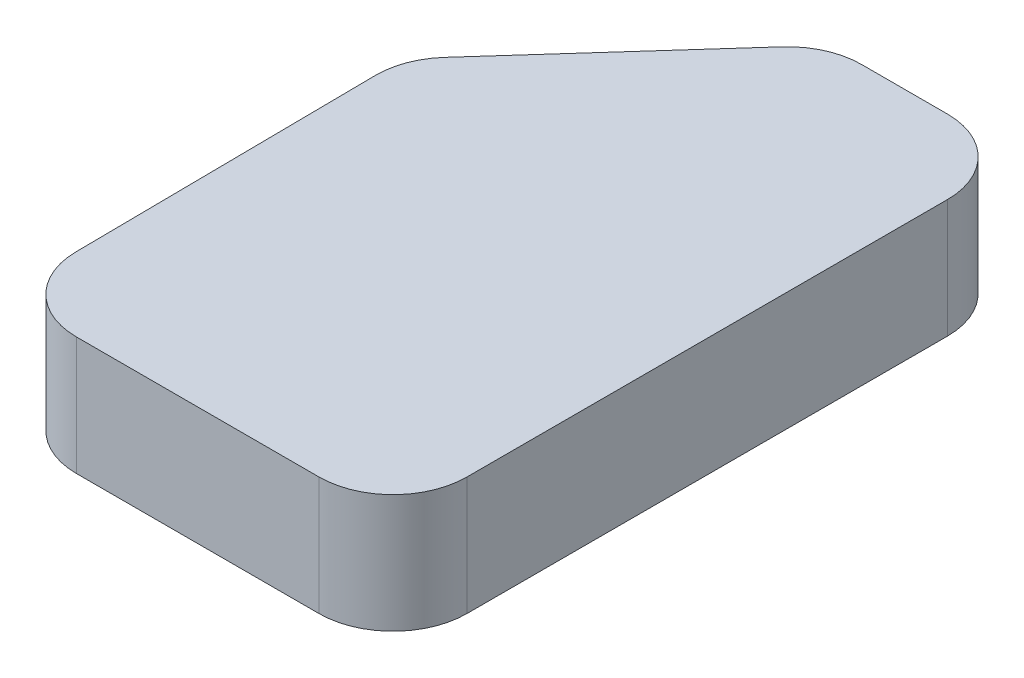
ISO-10303-21;
HEADER;
FILE_DESCRIPTION(('STEP AP214'),'2;1');
FILE_NAME('part.step','',(''),(''),'','','');
FILE_SCHEMA(('AUTOMOTIVE_DESIGN { 1 0 10303 214 1 1 1 1 }'));
ENDSEC;
DATA;
#1=APPLICATION_CONTEXT('core data for automotive mechanical design processes');
#2=APPLICATION_PROTOCOL_DEFINITION('international standard','automotive_design',2000,#1);
#3=PRODUCT_CONTEXT('',#1,'mechanical');
#4=PRODUCT('Part','Part','',(#3));
#5=PRODUCT_RELATED_PRODUCT_CATEGORY('part','',(#4));
#6=PRODUCT_DEFINITION_FORMATION('','',#4);
#7=PRODUCT_DEFINITION_CONTEXT('part definition',#1,'design');
#8=PRODUCT_DEFINITION('design','',#6,#7);
#9=PRODUCT_DEFINITION_SHAPE('','',#8);
#10=(LENGTH_UNIT() NAMED_UNIT(*) SI_UNIT(.MILLI.,.METRE.));
#11=(NAMED_UNIT(*) PLANE_ANGLE_UNIT() SI_UNIT($,.RADIAN.));
#12=(NAMED_UNIT(*) SI_UNIT($,.STERADIAN.) SOLID_ANGLE_UNIT());
#13=UNCERTAINTY_MEASURE_WITH_UNIT(LENGTH_MEASURE(1.E-05),#10,'distance_accuracy_value','');
#14=(GEOMETRIC_REPRESENTATION_CONTEXT(3) GLOBAL_UNCERTAINTY_ASSIGNED_CONTEXT((#13)) GLOBAL_UNIT_ASSIGNED_CONTEXT((#10,
#11,#12)) REPRESENTATION_CONTEXT('',''));
#15=CARTESIAN_POINT('',(0.,0.,0.));
#16=DIRECTION('',(0.,0.,1.));
#17=DIRECTION('',(1.,0.,0.));
#18=AXIS2_PLACEMENT_3D('',#15,#16,#17);
#19=CARTESIAN_POINT('',(0.,0.,85.));
#20=DIRECTION('',(0.,1.,0.));
#21=DIRECTION('',(0.,0.,1.));
#22=AXIS2_PLACEMENT_3D('',#19,#20,#21);
#23=PLANE('',#22);
#24=DIRECTION('',(1.,0.,0.));
#25=VECTOR('',#24,1.);
#26=CARTESIAN_POINT('',(0.,0.,0.));
#27=LINE('',#26,#25);
#28=CARTESIAN_POINT('',(58.3617304464966,0.,0.));
#29=VERTEX_POINT('',#28);
#30=CARTESIAN_POINT('',(70.,0.,0.));
#31=VERTEX_POINT('',#30);
#32=EDGE_CURVE('E133',#29,#31,#27,.T.);
#33=ORIENTED_EDGE('',*,*,#32,.T.);
#34=CARTESIAN_POINT('',(70.,0.,9.99999999999999));
#35=DIRECTION('',(0.,1.,0.));
#36=DIRECTION('',(0.,0.,1.));
#37=AXIS2_PLACEMENT_3D('',#34,#35,#36);
#38=CIRCLE('',#37,10.);
#39=CARTESIAN_POINT('',(80.,0.,9.99999999999999));
#40=VERTEX_POINT('',#39);
#41=EDGE_CURVE('E169',#31,#40,#38,.F.);
#42=ORIENTED_EDGE('',*,*,#41,.T.);
#43=DIRECTION('',(0.,0.,-1.));
#44=VECTOR('',#43,1.);
#45=CARTESIAN_POINT('',(80.,0.,85.));
#46=LINE('',#45,#44);
#47=CARTESIAN_POINT('',(80.,0.,75.));
#48=VERTEX_POINT('',#47);
#49=EDGE_CURVE('E147',#48,#40,#46,.T.);
#50=ORIENTED_EDGE('',*,*,#49,.F.);
#51=CARTESIAN_POINT('',(70.,0.,75.));
#52=DIRECTION('',(0.,1.,0.));
#53=DIRECTION('',(0.,0.,1.));
#54=AXIS2_PLACEMENT_3D('',#51,#52,#53);
#55=CIRCLE('',#54,10.);
#56=CARTESIAN_POINT('',(70.,0.,85.));
#57=VERTEX_POINT('',#56);
#58=EDGE_CURVE('E167',#48,#57,#55,.F.);
#59=ORIENTED_EDGE('',*,*,#58,.T.);
#60=DIRECTION('',(1.,0.,0.));
#61=VECTOR('',#60,1.);
#62=CARTESIAN_POINT('',(0.,0.,85.));
#63=LINE('',#62,#61);
#64=CARTESIAN_POINT('',(37.1976753077025,0.,85.));
#65=VERTEX_POINT('',#64);
#66=EDGE_CURVE('E135',#65,#57,#63,.T.);
#67=ORIENTED_EDGE('',*,*,#66,.F.);
#68=CARTESIAN_POINT('',(37.1976753077025,0.,75.));
#69=DIRECTION('',(0.,1.,0.));
#70=DIRECTION('',(0.,0.,1.));
#71=AXIS2_PLACEMENT_3D('',#68,#69,#70);
#72=CIRCLE('',#71,10.);
#73=CARTESIAN_POINT('',(27.1982021294255,0.,75.1026457837416));
#74=VERTEX_POINT('',#73);
#75=EDGE_CURVE('E53',#65,#74,#72,.F.);
#76=ORIENTED_EDGE('',*,*,#75,.T.);
#77=DIRECTION('',(0.0102645783741567,0.,0.999947317827695));
#78=VECTOR('',#77,1.);
#79=CARTESIAN_POINT('',(27.2997996498532,0.,85.));
#80=LINE('',#79,#78);
#81=CARTESIAN_POINT('',(26.7778913454717,0.,34.1571119538378));
#82=VERTEX_POINT('',#81);
#83=EDGE_CURVE('E185',#82,#74,#80,.T.);
#84=ORIENTED_EDGE('',*,*,#83,.F.);
#85=CARTESIAN_POINT('',(36.7773645237486,0.,34.0544661700962));
#86=DIRECTION('',(0.,1.,0.));
#87=DIRECTION('',(0.,0.,1.));
#88=AXIS2_PLACEMENT_3D('',#85,#86,#87);
#89=CIRCLE('',#88,10.);
#90=CARTESIAN_POINT('',(29.3344840482113,0.,27.3758787276152));
#91=VERTEX_POINT('',#90);
#92=EDGE_CURVE('E47',#82,#91,#89,.F.);
#93=ORIENTED_EDGE('',*,*,#92,.T.);
#94=DIRECTION('',(0.667858744248108,0.,-0.744288047553728));
#95=VECTOR('',#94,1.);
#96=CARTESIAN_POINT('',(29.8582506980114,0.,26.7921725764105));
#97=LINE('',#96,#95);
#98=CARTESIAN_POINT('',(50.9188499700445,0.,3.32141255792718));
#99=VERTEX_POINT('',#98);
#100=EDGE_CURVE('E105',#91,#99,#97,.T.);
#101=ORIENTED_EDGE('',*,*,#100,.T.);
#102=CARTESIAN_POINT('',(58.3617304464966,0.,10.0000000012292));
#103=DIRECTION('',(0.,1.,0.));
#104=DIRECTION('',(0.,0.,1.));
#105=AXIS2_PLACEMENT_3D('',#102,#103,#104);
#106=CIRCLE('',#105,10.0000000012292);
#107=EDGE_CURVE('E109',#99,#29,#106,.F.);
#108=ORIENTED_EDGE('',*,*,#107,.T.);
#109=EDGE_LOOP('',(#33,#42,#50,#59,#67,#76,#84,#93,#101,#108));
#110=FACE_BOUND('',#109,.T.);
#111=ADVANCED_FACE('F32',(#110),#23,.F.);
#112=CARTESIAN_POINT('',(0.,16.,85.));
#113=DIRECTION('',(0.,-1.,0.));
#114=DIRECTION('',(0.,0.,-1.));
#115=AXIS2_PLACEMENT_3D('',#112,#113,#114);
#116=PLANE('',#115);
#117=DIRECTION('',(0.,0.,-1.));
#118=VECTOR('',#117,1.);
#119=CARTESIAN_POINT('',(80.,16.,85.));
#120=LINE('',#119,#118);
#121=CARTESIAN_POINT('',(80.,16.,75.));
#122=VERTEX_POINT('',#121);
#123=CARTESIAN_POINT('',(80.,16.,9.99999999999999));
#124=VERTEX_POINT('',#123);
#125=EDGE_CURVE('E142',#122,#124,#120,.T.);
#126=ORIENTED_EDGE('',*,*,#125,.T.);
#127=CARTESIAN_POINT('',(70.,16.,9.99999999999999));
#128=DIRECTION('',(0.,-1.,0.));
#129=DIRECTION('',(0.,0.,-1.));
#130=AXIS2_PLACEMENT_3D('',#127,#128,#129);
#131=CIRCLE('',#130,10.);
#132=CARTESIAN_POINT('',(70.,16.,0.));
#133=VERTEX_POINT('',#132);
#134=EDGE_CURVE('E161',#124,#133,#131,.F.);
#135=ORIENTED_EDGE('',*,*,#134,.T.);
#136=DIRECTION('',(-1.,0.,0.));
#137=VECTOR('',#136,1.);
#138=CARTESIAN_POINT('',(0.,16.,0.));
#139=LINE('',#138,#137);
#140=CARTESIAN_POINT('',(58.3617304464966,16.,0.));
#141=VERTEX_POINT('',#140);
#142=EDGE_CURVE('E139',#133,#141,#139,.T.);
#143=ORIENTED_EDGE('',*,*,#142,.T.);
#144=CARTESIAN_POINT('',(58.3617304464966,16.,10.0000000012292));
#145=DIRECTION('',(0.,1.,0.));
#146=DIRECTION('',(0.,0.,1.));
#147=AXIS2_PLACEMENT_3D('',#144,#145,#146);
#148=CIRCLE('',#147,10.0000000012292);
#149=CARTESIAN_POINT('',(50.9188499700445,16.,3.32141255792718));
#150=VERTEX_POINT('',#149);
#151=EDGE_CURVE('E113',#150,#141,#148,.F.);
#152=ORIENTED_EDGE('',*,*,#151,.F.);
#153=DIRECTION('',(0.667858744248108,0.,-0.744288047553728));
#154=VECTOR('',#153,1.);
#155=CARTESIAN_POINT('',(29.8582506980114,16.,26.7921725764105));
#156=LINE('',#155,#154);
#157=CARTESIAN_POINT('',(29.3344840482113,16.,27.3758787276152));
#158=VERTEX_POINT('',#157);
#159=EDGE_CURVE('E119',#158,#150,#156,.T.);
#160=ORIENTED_EDGE('',*,*,#159,.F.);
#161=CARTESIAN_POINT('',(36.7773645237486,16.,34.0544661700962));
#162=DIRECTION('',(0.,-1.,0.));
#163=DIRECTION('',(0.,0.,-1.));
#164=AXIS2_PLACEMENT_3D('',#161,#162,#163);
#165=CIRCLE('',#164,10.);
#166=CARTESIAN_POINT('',(26.7778913454717,16.,34.1571119538378));
#167=VERTEX_POINT('',#166);
#168=EDGE_CURVE('E155',#158,#167,#165,.F.);
#169=ORIENTED_EDGE('',*,*,#168,.T.);
#170=DIRECTION('',(0.0102645783741567,0.,0.999947317827695));
#171=VECTOR('',#170,1.);
#172=CARTESIAN_POINT('',(27.2997996498532,16.,85.));
#173=LINE('',#172,#171);
#174=CARTESIAN_POINT('',(27.1982021294255,16.,75.1026457837416));
#175=VERTEX_POINT('',#174);
#176=EDGE_CURVE('E131',#167,#175,#173,.T.);
#177=ORIENTED_EDGE('',*,*,#176,.T.);
#178=CARTESIAN_POINT('',(37.1976753077025,16.,75.));
#179=DIRECTION('',(0.,-1.,0.));
#180=DIRECTION('',(0.,0.,-1.));
#181=AXIS2_PLACEMENT_3D('',#178,#179,#180);
#182=CIRCLE('',#181,10.);
#183=CARTESIAN_POINT('',(37.1976753077025,16.,85.));
#184=VERTEX_POINT('',#183);
#185=EDGE_CURVE('E157',#175,#184,#182,.F.);
#186=ORIENTED_EDGE('',*,*,#185,.T.);
#187=DIRECTION('',(-1.,0.,0.));
#188=VECTOR('',#187,1.);
#189=CARTESIAN_POINT('',(0.,16.,85.));
#190=LINE('',#189,#188);
#191=CARTESIAN_POINT('',(70.,16.,85.));
#192=VERTEX_POINT('',#191);
#193=EDGE_CURVE('E138',#192,#184,#190,.T.);
#194=ORIENTED_EDGE('',*,*,#193,.F.);
#195=CARTESIAN_POINT('',(70.,16.,75.));
#196=DIRECTION('',(0.,-1.,0.));
#197=DIRECTION('',(0.,0.,-1.));
#198=AXIS2_PLACEMENT_3D('',#195,#196,#197);
#199=CIRCLE('',#198,10.);
#200=EDGE_CURVE('E159',#192,#122,#199,.F.);
#201=ORIENTED_EDGE('',*,*,#200,.T.);
#202=EDGE_LOOP('',(#126,#135,#143,#152,#160,#169,#177,#186,#194,#201));
#203=FACE_BOUND('',#202,.T.);
#204=ADVANCED_FACE('F189',(#203),#116,.F.);
#205=CARTESIAN_POINT('',(80.,0.,85.));
#206=DIRECTION('',(-1.,0.,0.));
#207=DIRECTION('',(0.,0.,1.));
#208=AXIS2_PLACEMENT_3D('',#205,#206,#207);
#209=PLANE('',#208);
#210=ORIENTED_EDGE('',*,*,#49,.T.);
#211=DIRECTION('',(0.,1.,0.));
#212=VECTOR('',#211,1.);
#213=CARTESIAN_POINT('',(80.,16.,9.99999999999999));
#214=LINE('',#213,#212);
#215=EDGE_CURVE('E152',#40,#124,#214,.T.);
#216=ORIENTED_EDGE('',*,*,#215,.T.);
#217=ORIENTED_EDGE('',*,*,#125,.F.);
#218=DIRECTION('',(0.,1.,0.));
#219=VECTOR('',#218,1.);
#220=CARTESIAN_POINT('',(80.,0.,75.));
#221=LINE('',#220,#219);
#222=EDGE_CURVE('E150',#122,#48,#221,.F.);
#223=ORIENTED_EDGE('',*,*,#222,.T.);
#224=EDGE_LOOP('',(#210,#216,#217,#223));
#225=FACE_BOUND('',#224,.T.);
#226=ADVANCED_FACE('F205',(#225),#209,.F.);
#227=CARTESIAN_POINT('',(0.,0.,85.));
#228=DIRECTION('',(0.,0.,-1.));
#229=DIRECTION('',(-1.,0.,0.));
#230=AXIS2_PLACEMENT_3D('',#227,#228,#229);
#231=PLANE('',#230);
#232=ORIENTED_EDGE('',*,*,#66,.T.);
#233=DIRECTION('',(0.,1.,0.));
#234=VECTOR('',#233,1.);
#235=CARTESIAN_POINT('',(70.,0.,85.));
#236=LINE('',#235,#234);
#237=EDGE_CURVE('E174',#57,#192,#236,.T.);
#238=ORIENTED_EDGE('',*,*,#237,.T.);
#239=ORIENTED_EDGE('',*,*,#193,.T.);
#240=DIRECTION('',(0.,-1.,0.));
#241=VECTOR('',#240,1.);
#242=CARTESIAN_POINT('',(37.1976753077025,0.,85.));
#243=LINE('',#242,#241);
#244=EDGE_CURVE('E171',#184,#65,#243,.T.);
#245=ORIENTED_EDGE('',*,*,#244,.T.);
#246=EDGE_LOOP('',(#232,#238,#239,#245));
#247=FACE_BOUND('',#246,.T.);
#248=ADVANCED_FACE('F196',(#247),#231,.F.);
#249=CARTESIAN_POINT('',(0.,0.,0.));
#250=DIRECTION('',(0.,0.,-1.));
#251=DIRECTION('',(-1.,0.,0.));
#252=AXIS2_PLACEMENT_3D('',#249,#250,#251);
#253=PLANE('',#252);
#254=ORIENTED_EDGE('',*,*,#142,.F.);
#255=DIRECTION('',(0.,1.,0.));
#256=VECTOR('',#255,1.);
#257=CARTESIAN_POINT('',(70.,0.,0.));
#258=LINE('',#257,#256);
#259=EDGE_CURVE('E163',#133,#31,#258,.F.);
#260=ORIENTED_EDGE('',*,*,#259,.T.);
#261=ORIENTED_EDGE('',*,*,#32,.F.);
#262=DIRECTION('',(0.,1.,0.));
#263=VECTOR('',#262,1.);
#264=CARTESIAN_POINT('',(58.3617304464966,0.,0.));
#265=LINE('',#264,#263);
#266=EDGE_CURVE('E123',#29,#141,#265,.T.);
#267=ORIENTED_EDGE('',*,*,#266,.T.);
#268=EDGE_LOOP('',(#254,#260,#261,#267));
#269=FACE_BOUND('',#268,.T.);
#270=ADVANCED_FACE('F213',(#269),#253,.T.);
#271=CARTESIAN_POINT('',(29.8582506980114,0.,26.7921725764105));
#272=DIRECTION('',(0.744288047553728,0.,0.667858744248108));
#273=DIRECTION('',(0.667858744248108,0.,-0.744288047553728));
#274=AXIS2_PLACEMENT_3D('',#271,#272,#273);
#275=PLANE('',#274);
#276=ORIENTED_EDGE('',*,*,#100,.F.);
#277=DIRECTION('',(0.,-1.,0.));
#278=VECTOR('',#277,1.);
#279=CARTESIAN_POINT('',(29.3344840482113,0.,27.3758787276152));
#280=LINE('',#279,#278);
#281=EDGE_CURVE('E11',#91,#158,#280,.F.);
#282=ORIENTED_EDGE('',*,*,#281,.T.);
#283=ORIENTED_EDGE('',*,*,#159,.T.);
#284=DIRECTION('',(0.,1.,0.));
#285=VECTOR('',#284,1.);
#286=CARTESIAN_POINT('',(50.9188499700445,0.,3.32141255792718));
#287=LINE('',#286,#285);
#288=EDGE_CURVE('E116',#99,#150,#287,.T.);
#289=ORIENTED_EDGE('',*,*,#288,.F.);
#290=EDGE_LOOP('',(#276,#282,#283,#289));
#291=FACE_BOUND('',#290,.T.);
#292=ADVANCED_FACE('F117',(#291),#275,.F.);
#293=CARTESIAN_POINT('',(58.3617304464966,0.,10.0000000012292));
#294=DIRECTION('',(0.,1.,0.));
#295=DIRECTION('',(0.,0.,1.));
#296=AXIS2_PLACEMENT_3D('',#293,#294,#295);
#297=CYLINDRICAL_SURFACE('',#296,10.0000000012292);
#298=ORIENTED_EDGE('',*,*,#151,.T.);
#299=ORIENTED_EDGE('',*,*,#266,.F.);
#300=ORIENTED_EDGE('',*,*,#107,.F.);
#301=ORIENTED_EDGE('',*,*,#288,.T.);
#302=EDGE_LOOP('',(#298,#299,#300,#301));
#303=FACE_BOUND('',#302,.T.);
#304=ADVANCED_FACE('F125',(#303),#297,.T.);
#305=CARTESIAN_POINT('',(27.2997996498532,16.,85.));
#306=DIRECTION('',(0.999947317827695,0.,-0.0102645783741567));
#307=DIRECTION('',(-0.0102645783741567,0.,-0.999947317827695));
#308=AXIS2_PLACEMENT_3D('',#305,#306,#307);
#309=PLANE('',#308);
#310=ORIENTED_EDGE('',*,*,#83,.T.);
#311=DIRECTION('',(0.,-1.,0.));
#312=VECTOR('',#311,1.);
#313=CARTESIAN_POINT('',(27.1982021294255,16.,75.1026457837416));
#314=LINE('',#313,#312);
#315=EDGE_CURVE('E40',#74,#175,#314,.F.);
#316=ORIENTED_EDGE('',*,*,#315,.T.);
#317=ORIENTED_EDGE('',*,*,#176,.F.);
#318=DIRECTION('',(0.,-1.,0.));
#319=VECTOR('',#318,1.);
#320=CARTESIAN_POINT('',(26.7778913454717,16.,34.1571119538378));
#321=LINE('',#320,#319);
#322=EDGE_CURVE('E177',#167,#82,#321,.T.);
#323=ORIENTED_EDGE('',*,*,#322,.T.);
#324=EDGE_LOOP('',(#310,#316,#317,#323));
#325=FACE_BOUND('',#324,.T.);
#326=ADVANCED_FACE('F183',(#325),#309,.F.);
#327=CARTESIAN_POINT('',(70.,0.,9.99999999999999));
#328=DIRECTION('',(0.,-1.,0.));
#329=DIRECTION('',(0.,0.,-1.));
#330=AXIS2_PLACEMENT_3D('',#327,#328,#329);
#331=CYLINDRICAL_SURFACE('',#330,10.);
#332=ORIENTED_EDGE('',*,*,#41,.F.);
#333=ORIENTED_EDGE('',*,*,#259,.F.);
#334=ORIENTED_EDGE('',*,*,#134,.F.);
#335=ORIENTED_EDGE('',*,*,#215,.F.);
#336=EDGE_LOOP('',(#332,#333,#334,#335));
#337=FACE_BOUND('',#336,.T.);
#338=ADVANCED_FACE('F209',(#337),#331,.T.);
#339=CARTESIAN_POINT('',(70.,0.,75.));
#340=DIRECTION('',(0.,1.,0.));
#341=DIRECTION('',(0.,0.,1.));
#342=AXIS2_PLACEMENT_3D('',#339,#340,#341);
#343=CYLINDRICAL_SURFACE('',#342,10.);
#344=ORIENTED_EDGE('',*,*,#58,.F.);
#345=ORIENTED_EDGE('',*,*,#222,.F.);
#346=ORIENTED_EDGE('',*,*,#200,.F.);
#347=ORIENTED_EDGE('',*,*,#237,.F.);
#348=EDGE_LOOP('',(#344,#345,#346,#347));
#349=FACE_BOUND('',#348,.T.);
#350=ADVANCED_FACE('F202',(#349),#343,.T.);
#351=CARTESIAN_POINT('',(37.1976753077025,0.,75.));
#352=DIRECTION('',(0.,-1.,0.));
#353=DIRECTION('',(0.,0.,-1.));
#354=AXIS2_PLACEMENT_3D('',#351,#352,#353);
#355=CYLINDRICAL_SURFACE('',#354,10.);
#356=ORIENTED_EDGE('',*,*,#185,.F.);
#357=ORIENTED_EDGE('',*,*,#315,.F.);
#358=ORIENTED_EDGE('',*,*,#75,.F.);
#359=ORIENTED_EDGE('',*,*,#244,.F.);
#360=EDGE_LOOP('',(#356,#357,#358,#359));
#361=FACE_BOUND('',#360,.T.);
#362=ADVANCED_FACE('F194',(#361),#355,.T.);
#363=CARTESIAN_POINT('',(36.7773645237486,16.,34.0544661700962));
#364=DIRECTION('',(0.,-1.,0.));
#365=DIRECTION('',(0.,0.,-1.));
#366=AXIS2_PLACEMENT_3D('',#363,#364,#365);
#367=CYLINDRICAL_SURFACE('',#366,10.);
#368=ORIENTED_EDGE('',*,*,#168,.F.);
#369=ORIENTED_EDGE('',*,*,#281,.F.);
#370=ORIENTED_EDGE('',*,*,#92,.F.);
#371=ORIENTED_EDGE('',*,*,#322,.F.);
#372=EDGE_LOOP('',(#368,#369,#370,#371));
#373=FACE_BOUND('',#372,.T.);
#374=ADVANCED_FACE('F34',(#373),#367,.T.);
#375=CLOSED_SHELL('',(#111,#204,#226,#248,#270,#292,#304,#326,#338,#350,#362,#374));
#376=MANIFOLD_SOLID_BREP('B2',#375);
#377=ADVANCED_BREP_SHAPE_REPRESENTATION('',(#18,#376),#14);
#378=SHAPE_DEFINITION_REPRESENTATION(#9,#377);
ENDSEC;
END-ISO-10303-21;
